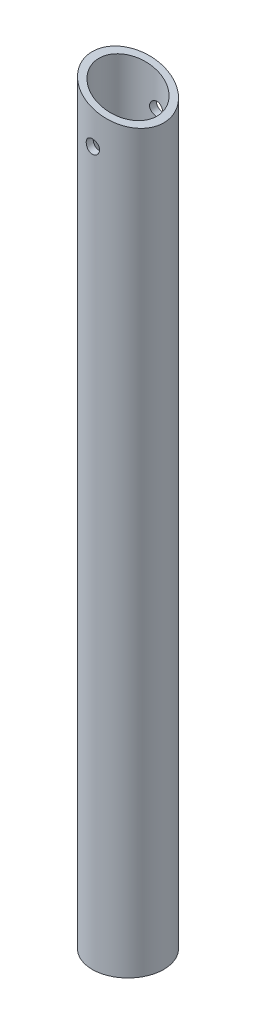
ISO-10303-21;
HEADER;
FILE_DESCRIPTION(('STEP AP214'),'2;1');
FILE_NAME('part.step','',(''),(''),'','','');
FILE_SCHEMA(('AUTOMOTIVE_DESIGN { 1 0 10303 214 1 1 1 1 }'));
ENDSEC;
DATA;
#1=APPLICATION_CONTEXT('core data for automotive mechanical design processes');
#2=APPLICATION_PROTOCOL_DEFINITION('international standard','automotive_design',2000,#1);
#3=PRODUCT_CONTEXT('',#1,'mechanical');
#4=PRODUCT('Part','Part','',(#3));
#5=PRODUCT_RELATED_PRODUCT_CATEGORY('part','',(#4));
#6=PRODUCT_DEFINITION_FORMATION('','',#4);
#7=PRODUCT_DEFINITION_CONTEXT('part definition',#1,'design');
#8=PRODUCT_DEFINITION('design','',#6,#7);
#9=PRODUCT_DEFINITION_SHAPE('','',#8);
#10=(LENGTH_UNIT() NAMED_UNIT(*) SI_UNIT(.MILLI.,.METRE.));
#11=(NAMED_UNIT(*) PLANE_ANGLE_UNIT() SI_UNIT($,.RADIAN.));
#12=(NAMED_UNIT(*) SI_UNIT($,.STERADIAN.) SOLID_ANGLE_UNIT());
#13=UNCERTAINTY_MEASURE_WITH_UNIT(LENGTH_MEASURE(1.E-05),#10,'distance_accuracy_value','');
#14=(GEOMETRIC_REPRESENTATION_CONTEXT(3) GLOBAL_UNCERTAINTY_ASSIGNED_CONTEXT((#13)) GLOBAL_UNIT_ASSIGNED_CONTEXT((#10,
#11,#12)) REPRESENTATION_CONTEXT('',''));
#15=CARTESIAN_POINT('',(0.,0.,0.));
#16=DIRECTION('',(0.,0.,1.));
#17=DIRECTION('',(1.,0.,0.));
#18=AXIS2_PLACEMENT_3D('',#15,#16,#17);
#19=CARTESIAN_POINT('',(0.,0.,0.));
#20=DIRECTION('',(0.,1.,0.));
#21=DIRECTION('',(0.,0.,1.));
#22=AXIS2_PLACEMENT_3D('',#19,#20,#21);
#23=PLANE('',#22);
#24=CARTESIAN_POINT('',(0.,0.,0.));
#25=DIRECTION('',(0.,1.,0.));
#26=DIRECTION('',(0.,0.,1.));
#27=AXIS2_PLACEMENT_3D('',#24,#25,#26);
#28=CIRCLE('',#27,8.);
#29=CARTESIAN_POINT('',(0.,0.,8.));
#30=VERTEX_POINT('',#29);
#31=EDGE_CURVE('E12',#30,#30,#28,.T.);
#32=ORIENTED_EDGE('',*,*,#31,.F.);
#33=EDGE_LOOP('',(#32));
#34=FACE_BOUND('',#33,.T.);
#35=CARTESIAN_POINT('',(0.,0.,0.));
#36=DIRECTION('',(0.,1.,0.));
#37=DIRECTION('',(0.,0.,1.));
#38=AXIS2_PLACEMENT_3D('',#35,#36,#37);
#39=CIRCLE('',#38,6.5);
#40=CARTESIAN_POINT('',(0.,0.,6.5));
#41=VERTEX_POINT('',#40);
#42=EDGE_CURVE('E62',#41,#41,#39,.T.);
#43=ORIENTED_EDGE('',*,*,#42,.T.);
#44=EDGE_LOOP('',(#43));
#45=FACE_BOUND('',#44,.T.);
#46=ADVANCED_FACE('F48',(#34,#45),#23,.F.);
#47=CARTESIAN_POINT('',(0.,170.,0.));
#48=DIRECTION('',(0.,-1.,0.));
#49=DIRECTION('',(0.,0.,-1.));
#50=AXIS2_PLACEMENT_3D('',#47,#48,#49);
#51=CYLINDRICAL_SURFACE('',#50,8.);
#52=CARTESIAN_POINT('',(0.,161.08823812587,-8.00000000000001));
#53=CARTESIAN_POINT('',(-0.0834717464655491,161.088234936282,-7.99999848833852));
#54=CARTESIAN_POINT('',(-0.166984992730171,161.081247049251,-7.99868009921717));
#55=CARTESIAN_POINT('',(-0.331658129841866,161.053498130752,-7.99354785890523));
#56=CARTESIAN_POINT('',(-0.412815974152295,161.032725475231,-7.98973190166897));
#57=CARTESIAN_POINT('',(-0.570372961851855,160.978065424611,-7.98003138765458));
#58=CARTESIAN_POINT('',(-0.64677633068538,160.944189873418,-7.97414869946486));
#59=CARTESIAN_POINT('',(-0.792807973094041,160.864319248948,-7.96095710599786));
#60=CARTESIAN_POINT('',(-0.862436794477373,160.818325156726,-7.95364831618289));
#61=CARTESIAN_POINT('',(-0.993783715930548,160.714938357867,-7.93831336430503));
#62=CARTESIAN_POINT('',(-1.05540895503186,160.6574286812,-7.93028034856354));
#63=CARTESIAN_POINT('',(-1.16819606135372,160.532894816783,-7.91445318458653));
#64=CARTESIAN_POINT('',(-1.21935717689247,160.465869946101,-7.90665905354526));
#65=CARTESIAN_POINT('',(-1.31014998665798,160.323552037507,-7.89212551245004));
#66=CARTESIAN_POINT('',(-1.34968721969608,160.248197755553,-7.88539493886185));
#67=CARTESIAN_POINT('',(-1.41550524332285,160.091769210694,-7.8738471321199));
#68=CARTESIAN_POINT('',(-1.44178717713103,160.010695441759,-7.86902973396962));
#69=CARTESIAN_POINT('',(-1.48005053503505,159.846122894956,-7.8619226957455));
#70=CARTESIAN_POINT('',(-1.49219390192041,159.762663028667,-7.85960445366407));
#71=CARTESIAN_POINT('',(-1.5023380809535,159.594860741062,-7.85767197152764));
#72=CARTESIAN_POINT('',(-1.50034016135381,159.510518399568,-7.8580574889876));
#73=CARTESIAN_POINT('',(-1.4823897960237,159.344518600604,-7.86146292701752));
#74=CARTESIAN_POINT('',(-1.46662149996049,159.26284041157,-7.86444808147336));
#75=CARTESIAN_POINT('',(-1.42186799396211,159.103309706088,-7.87266183284669));
#76=CARTESIAN_POINT('',(-1.39288222239506,159.025457352361,-7.87789052509517));
#77=CARTESIAN_POINT('',(-1.32233647179308,158.87524944687,-7.89003855292589));
#78=CARTESIAN_POINT('',(-1.28070213532462,158.80292965529,-7.89696783823368));
#79=CARTESIAN_POINT('',(-1.18609368930421,158.66623339733,-7.9117297160292));
#80=CARTESIAN_POINT('',(-1.13311842889271,158.601857738156,-7.91956240015523));
#81=CARTESIAN_POINT('',(-1.01633905685303,158.481813170198,-7.93540001272165));
#82=CARTESIAN_POINT('',(-0.95237743686075,158.426297473419,-7.94340571024033));
#83=CARTESIAN_POINT('',(-0.815968037098896,158.326760885195,-7.95857386108321));
#84=CARTESIAN_POINT('',(-0.743520172255828,158.282740109,-7.96573630595246));
#85=CARTESIAN_POINT('',(-0.59203498887472,158.207420372001,-7.9784253967751));
#86=CARTESIAN_POINT('',(-0.512989564446547,158.176137346753,-7.98394999136292));
#87=CARTESIAN_POINT('',(-0.350639115398744,158.127336032778,-7.99272505402722));
#88=CARTESIAN_POINT('',(-0.267334544277828,158.109816281825,-7.99597576367995));
#89=CARTESIAN_POINT('',(-0.100148652903422,158.089252094852,-7.99980360641982));
#90=CARTESIAN_POINT('',(-0.0162940126341757,158.085997734341,-8.00041950912282));
#91=CARTESIAN_POINT('',(0.150761248092132,158.093493605418,-7.9990154359823));
#92=CARTESIAN_POINT('',(0.233961900480325,158.104243148936,-7.9969955896443));
#93=CARTESIAN_POINT('',(0.396681573218159,158.139267161054,-7.99057111500405));
#94=CARTESIAN_POINT('',(0.476224261046016,158.163435408408,-7.98618522374033));
#95=CARTESIAN_POINT('',(0.630128631824595,158.224495832649,-7.97551842212502));
#96=CARTESIAN_POINT('',(0.704489962595063,158.261388873436,-7.96923738311336));
#97=CARTESIAN_POINT('',(0.84681667151317,158.34731625403,-7.95538030357667));
#98=CARTESIAN_POINT('',(0.914703277015073,158.396478864407,-7.94779086174566));
#99=CARTESIAN_POINT('',(1.04133832326448,158.505376263233,-7.93219343489715));
#100=CARTESIAN_POINT('',(1.10008590976078,158.565112038872,-7.92418541084688));
#101=CARTESIAN_POINT('',(1.20757295872041,158.694410444782,-7.90852475697452));
#102=CARTESIAN_POINT('',(1.25616916218573,158.764093033996,-7.9008782586026));
#103=CARTESIAN_POINT('',(1.34096675057784,158.910755750394,-7.88692985578534));
#104=CARTESIAN_POINT('',(1.37716859613918,158.987735606241,-7.8806279013735));
#105=CARTESIAN_POINT('',(1.43594673512817,159.146443993113,-7.87013024209574));
#106=CARTESIAN_POINT('',(1.45858868794783,159.22814750543,-7.86592440436881));
#107=CARTESIAN_POINT('',(1.48980679326234,159.394285348392,-7.86007203802418));
#108=CARTESIAN_POINT('',(1.49838453270704,159.478719369841,-7.8584252206579));
#109=CARTESIAN_POINT('',(1.5011776214835,159.646486457312,-7.85789199803858));
#110=CARTESIAN_POINT('',(1.49561895003496,159.729815706827,-7.85896215974296));
#111=CARTESIAN_POINT('',(1.470791753788,159.894329547916,-7.86364600660001));
#112=CARTESIAN_POINT('',(1.45152331089327,159.975514152298,-7.86725967655748));
#113=CARTESIAN_POINT('',(1.39991887583258,160.133312610666,-7.87660508023181));
#114=CARTESIAN_POINT('',(1.36760735397249,160.209934717216,-7.88233284594969));
#115=CARTESIAN_POINT('',(1.29085868912201,160.356706380111,-7.89526387551842));
#116=CARTESIAN_POINT('',(1.2464206894818,160.426855478715,-7.90246724360119));
#117=CARTESIAN_POINT('',(1.14589487339528,160.559821805913,-7.91767266107744));
#118=CARTESIAN_POINT('',(1.08964259864298,160.622513538438,-7.92568505353046));
#119=CARTESIAN_POINT('',(0.967427926742238,160.737643288335,-7.94152833918739));
#120=CARTESIAN_POINT('',(0.901463301891558,160.790078946851,-7.94935919027329));
#121=CARTESIAN_POINT('',(0.76098494507181,160.883649078498,-7.96403975968049));
#122=CARTESIAN_POINT('',(0.686399590640453,160.924677554361,-7.97088000990564));
#123=CARTESIAN_POINT('',(0.53129011365377,160.993555762476,-7.9827161938069));
#124=CARTESIAN_POINT('',(0.450771651705185,161.021417872917,-7.98771385879038));
#125=CARTESIAN_POINT('',(0.308347202825083,161.057515440289,-7.99428290707633));
#126=CARTESIAN_POINT('',(0.247273810251794,161.069016756183,-7.99641470878209));
#127=CARTESIAN_POINT('',(0.124141247115075,161.084379187987,-7.99927379954013));
#128=CARTESIAN_POINT('',(0.0620821016526262,161.088240498126,-8.00000112429806));
#129=CARTESIAN_POINT('',(0.,161.08823812587,-8.00000000000001));
#130=B_SPLINE_CURVE_WITH_KNOTS('',3,(#52,#53,#54,#55,#56,#57,#58,#59,#60,#61,#62,#63,#64,#65,
#66,#67,#68,#69,#70,#71,#72,#73,#74,#75,#76,#77,#78,#79,#80,#81,#82,#83,#84,#85,#86,#87,#88,#89,
#90,#91,#92,#93,#94,#95,#96,#97,#98,#99,#100,#101,#102,#103,#104,#105,#106,#107,#108,#109,#110,
#111,#112,#113,#114,#115,#116,#117,#118,#119,#120,#121,#122,#123,#124,#125,#126,#127,#128,#129),
.UNSPECIFIED.,.T.,.F.,(4,2,2,2,2,2,2,2,2,2,2,2,2,2,2,2,2,2,2,2,2,2,2,2,2,2,2,2,2,2,2,2,2,2,2,2,
2,2,4),(0.,0.250188200964912,0.500587642535419,0.750761271230876,1.00091465336886,
1.25375118013625,1.50660586283611,1.76146190504355,2.01629596311945,2.26818151445329,
2.52004447587248,2.76859000612758,3.01714609846783,3.26719262629525,3.51726454049852,
3.7712776846407,4.0252933754494,4.27962588321694,4.53393136673742,4.78448174076092,
5.03501980464579,5.28360233907823,5.53220175338025,5.78351778017702,6.03485728413091,
6.28953436987293,6.54420198954941,6.79762627818557,7.05102196946511,7.30039252231745,
7.54976158541504,7.79866496207689,8.04758592655419,8.30023369966379,8.55293951262252,
8.80792048916313,9.06266126931173,9.24874344524409,9.43482089039541),.UNSPECIFIED.);
#131=CARTESIAN_POINT('',(0.,161.08823812587,-8.00000000000001));
#132=VERTEX_POINT('',#131);
#133=EDGE_CURVE('E67',#132,#132,#130,.T.);
#134=ORIENTED_EDGE('',*,*,#133,.T.);
#135=EDGE_LOOP('',(#134));
#136=FACE_BOUND('',#135,.T.);
#137=CARTESIAN_POINT('',(1.49999999999992,159.58823812587,7.85811682275084));
#138=CARTESIAN_POINT('',(1.49999679883237,159.504780917859,7.85811843793492));
#139=CARTESIAN_POINT('',(1.49301126348931,159.421282177652,7.85946079760263));
#140=CARTESIAN_POINT('',(1.46527253251804,159.256639164289,7.86467851014362));
#141=CARTESIAN_POINT('',(1.44450765768474,159.175496949443,7.86855601173206));
#142=CARTESIAN_POINT('',(1.38987035617784,159.0179730545,7.87838976464885));
#143=CARTESIAN_POINT('',(1.35601013954372,158.941587016563,7.88434407905994));
#144=CARTESIAN_POINT('',(1.27617565760363,158.795584566584,7.89765826320956));
#145=CARTESIAN_POINT('',(1.23020233759189,158.725967626867,7.90501802325622));
#146=CARTESIAN_POINT('',(1.12683678942618,158.594607926671,7.92041614838945));
#147=CARTESIAN_POINT('',(1.0693229293309,158.532961642399,7.92846116625676));
#148=CARTESIAN_POINT('',(0.944771778803541,158.420133736271,7.94426457664031));
#149=CARTESIAN_POINT('',(0.877733863624922,158.368952801446,7.95202295031152));
#150=CARTESIAN_POINT('',(0.735403894570143,158.27813874927,7.96645017828404));
#151=CARTESIAN_POINT('',(0.660052840033863,158.238596592351,7.97311028052359));
#152=CARTESIAN_POINT('',(0.503631283250773,158.172768583597,7.98451608632928));
#153=CARTESIAN_POINT('',(0.422561251859514,158.14648164188,7.98926194728335));
#154=CARTESIAN_POINT('',(0.258002746187417,158.108208577259,7.99625755123779));
#155=CARTESIAN_POINT('',(0.174553323244854,158.096059819948,7.99853565976324));
#156=CARTESIAN_POINT('',(0.00677167603537077,158.08590123817,8.00043684615591));
#157=CARTESIAN_POINT('',(-0.0775604724476873,158.087890209731,8.00006015010697));
#158=CARTESIAN_POINT('',(-0.243598357899423,158.105825897018,7.99671633763242));
#159=CARTESIAN_POINT('',(-0.3253237604515,158.121597495301,7.99378172247211));
#160=CARTESIAN_POINT('',(-0.484947165715499,158.166373775266,7.98568826333558));
#161=CARTESIAN_POINT('',(-0.562845028826553,158.195378939216,7.98052933829965));
#162=CARTESIAN_POINT('',(-0.713110065751531,158.265965856929,7.96851260297338));
#163=CARTESIAN_POINT('',(-0.785443571838551,158.307617613783,7.96164537590823));
#164=CARTESIAN_POINT('',(-0.922159977214663,158.402263794948,7.94697147542847));
#165=CARTESIAN_POINT('',(-0.98654206691081,158.455259372758,7.93916470651163));
#166=CARTESIAN_POINT('',(-1.10656561896907,158.572053828854,7.92333513680565));
#167=CARTESIAN_POINT('',(-1.16205790757045,158.636005909773,7.91531085901618));
#168=CARTESIAN_POINT('',(-1.26155171851264,158.772387657149,7.90006508924618));
#169=CARTESIAN_POINT('',(-1.30555307271185,158.844817447635,7.89284360901352));
#170=CARTESIAN_POINT('',(-1.3808585222448,158.996296396573,7.88001893307122));
#171=CARTESIAN_POINT('',(-1.41214093645423,159.075356583061,7.87441850530258));
#172=CARTESIAN_POINT('',(-1.4609365697506,159.237739309994,7.86551242396687));
#173=CARTESIAN_POINT('',(-1.47845134901115,159.321061366335,7.86220651038621));
#174=CARTESIAN_POINT('',(-1.49899672649745,159.488257454726,7.85831520301006));
#175=CARTESIAN_POINT('',(-1.50224164285862,159.572104241436,7.85768955816134));
#176=CARTESIAN_POINT('',(-1.49472968881726,159.739141580958,7.85912191420837));
#177=CARTESIAN_POINT('',(-1.48397351086435,159.822332166019,7.86117978238612));
#178=CARTESIAN_POINT('',(-1.44894868195885,159.984991028925,7.86770980063206));
#179=CARTESIAN_POINT('',(-1.42479238583991,160.064484378495,7.87216186690876));
#180=CARTESIAN_POINT('',(-1.36377224379061,160.218295315601,7.88296134156616));
#181=CARTESIAN_POINT('',(-1.32690746128796,160.292612521186,7.88930888963281));
#182=CARTESIAN_POINT('',(-1.24102353119661,160.434905744914,7.90327577863685));
#183=CARTESIAN_POINT('',(-1.19186899639622,160.502798663737,7.91090895425312));
#184=CARTESIAN_POINT('',(-1.08298344344249,160.629450166085,7.92654811368098));
#185=CARTESIAN_POINT('',(-1.02325147433088,160.688207927426,7.93455413096495));
#186=CARTESIAN_POINT('',(-0.893949417870436,160.795721889405,7.95016624005947));
#187=CARTESIAN_POINT('',(-0.824258534095928,160.844333952476,7.95776555833302));
#188=CARTESIAN_POINT('',(-0.677574523040174,160.929159332048,7.97159404810347));
#189=CARTESIAN_POINT('',(-0.600581677038573,160.965373125895,7.97782327234725));
#190=CARTESIAN_POINT('',(-0.441877541578731,161.024158223735,7.98818057995848));
#191=CARTESIAN_POINT('',(-0.360193213079027,161.046800313432,7.99231954730139));
#192=CARTESIAN_POINT('',(-0.194096227381601,161.07802517416,7.99807642083742));
#193=CARTESIAN_POINT('',(-0.109683858215881,161.086609424533,7.99969459229934));
#194=CARTESIAN_POINT('',(0.0580907602504762,161.089423427389,8.00022227515442));
#195=CARTESIAN_POINT('',(0.141449307066231,161.083870879,7.9991728662503));
#196=CARTESIAN_POINT('',(0.306023369279161,161.059045698102,7.99456866611699));
#197=CARTESIAN_POINT('',(0.387238905213654,161.039773197126,7.9910138989067));
#198=CARTESIAN_POINT('',(0.545106475595446,160.988146918487,7.98179837978043));
#199=CARTESIAN_POINT('',(0.621766319318179,160.955816312989,7.97614135981573));
#200=CARTESIAN_POINT('',(0.768605631316638,160.879017672215,7.96333372068769));
#201=CARTESIAN_POINT('',(0.838784665003208,160.834548823764,7.95618300146483));
#202=CARTESIAN_POINT('',(0.971755027779948,160.733986671428,7.94104779859941));
#203=CARTESIAN_POINT('',(1.03442623539048,160.677736092009,7.9330528459127));
#204=CARTESIAN_POINT('',(1.14951536065482,160.555533563378,7.9171963353883));
#205=CARTESIAN_POINT('',(1.20193086324778,160.489579335497,7.90933480936763));
#206=CARTESIAN_POINT('',(1.29547633945382,160.349111671167,7.89455577425924));
#207=CARTESIAN_POINT('',(1.33649740531868,160.274524686203,7.88764767280726));
#208=CARTESIAN_POINT('',(1.40536132423413,160.119412335891,7.8756708465003));
#209=CARTESIAN_POINT('',(1.43321661638909,160.038892659281,7.87060038649115));
#210=CARTESIAN_POINT('',(1.46929726596173,159.896485837805,7.86393016292123));
#211=CARTESIAN_POINT('',(1.48079105739849,159.835432402109,7.86176310717929));
#212=CARTESIAN_POINT('',(1.49614351076211,159.71233965745,7.85885585595502));
#213=CARTESIAN_POINT('',(1.50000238052119,159.65030037537,7.85811562163281));
#214=CARTESIAN_POINT('',(1.49999999999992,159.58823812587,7.85811682275084));
#215=B_SPLINE_CURVE_WITH_KNOTS('',3,(#137,#138,#139,#140,#141,#142,#143,#144,#145,#146,#147,
#148,#149,#150,#151,#152,#153,#154,#155,#156,#157,#158,#159,#160,#161,#162,#163,#164,#165,#166,
#167,#168,#169,#170,#171,#172,#173,#174,#175,#176,#177,#178,#179,#180,#181,#182,#183,#184,#185,
#186,#187,#188,#189,#190,#191,#192,#193,#194,#195,#196,#197,#198,#199,#200,#201,#202,#203,#204,
#205,#206,#207,#208,#209,#210,#211,#212,#213,#214),.UNSPECIFIED.,.T.,.F.,(4,2,2,2,2,2,2,2,2,2,2,
2,2,2,2,2,2,2,2,2,2,2,2,2,2,2,2,2,2,2,2,2,2,2,2,2,2,2,4),(0.,0.250144505793205,0.50050130238039,
0.750625227978428,1.00072963993907,1.25362335698688,1.5065336706931,1.76137104348042,
2.01618745939636,2.26804275460258,2.51987660200647,2.76855650598723,3.01724547328422,
3.26733691984216,3.51745380911782,3.77140614764064,4.02536220192399,4.27974936118265,
4.53410768866487,4.78463248587077,5.0351448933872,5.2835879231537,5.53204926624317,
5.78337862654144,6.03473059394676,6.28944125495868,6.54414210821703,6.79750269418682,
7.0508366166733,7.30029300570137,7.54974700322165,7.79876026530355,8.04779021357108,
8.30038464008743,8.55303847730761,8.80803001818116,9.0627801574912,9.24880307527214,
9.43482092920425),.UNSPECIFIED.);
#216=CARTESIAN_POINT('',(1.49999999999992,159.58823812587,7.85811682275084));
#217=VERTEX_POINT('',#216);
#218=EDGE_CURVE('E92',#217,#217,#215,.T.);
#219=ORIENTED_EDGE('',*,*,#218,.T.);
#220=EDGE_LOOP('',(#219));
#221=FACE_BOUND('',#220,.T.);
#222=CARTESIAN_POINT('',(0.,167.088238125871,0.));
#223=DIRECTION('',(-0.342020143325661,-0.939692620785911,0.));
#224=DIRECTION('',(0.939692620785911,-0.342020143325661,0.));
#225=AXIS2_PLACEMENT_3D('',#222,#223,#224);
#226=ELLIPSE('',#225,8.51342217980727,8.);
#227=CARTESIAN_POINT('',(7.99999999999997,164.176476251741,0.));
#228=VERTEX_POINT('',#227);
#229=EDGE_CURVE('E73',#228,#228,#226,.T.);
#230=ORIENTED_EDGE('',*,*,#229,.T.);
#231=EDGE_LOOP('',(#230));
#232=FACE_BOUND('',#231,.T.);
#233=ORIENTED_EDGE('',*,*,#31,.T.);
#234=EDGE_LOOP('',(#233));
#235=FACE_BOUND('',#234,.T.);
#236=ADVANCED_FACE('F50',(#136,#221,#232,#235),#51,.T.);
#237=CARTESIAN_POINT('',(0.,170.,0.));
#238=DIRECTION('',(0.,-1.,0.));
#239=DIRECTION('',(0.,0.,-1.));
#240=AXIS2_PLACEMENT_3D('',#237,#238,#239);
#241=CYLINDRICAL_SURFACE('',#240,6.5);
#242=CARTESIAN_POINT('',(0.,161.08823812587,-6.50000000000001));
#243=CARTESIAN_POINT('',(-0.0830761724763878,161.088235460515,-6.49999849532867));
#244=CARTESIAN_POINT('',(-0.166183602986877,161.081313199059,-6.49839124214549));
#245=CARTESIAN_POINT('',(-0.330029933246678,161.053840482985,-6.49213500375532));
#246=CARTESIAN_POINT('',(-0.410767233683417,161.033281037429,-6.48748401185166));
#247=CARTESIAN_POINT('',(-0.56748240064949,160.97921842693,-6.47565710646771));
#248=CARTESIAN_POINT('',(-0.643465410432001,160.945729540739,-6.46848397910975));
#249=CARTESIAN_POINT('',(-0.788732955280558,160.866805860802,-6.45238316831831));
#250=CARTESIAN_POINT('',(-0.858017512836019,160.821371107165,-6.44345549077588));
#251=CARTESIAN_POINT('',(-0.989152353123286,160.718992874193,-6.4246432330502));
#252=CARTESIAN_POINT('',(-1.05086679216126,160.661877764168,-6.4147456865414));
#253=CARTESIAN_POINT('',(-1.16393060397699,160.538128199299,-6.39519859507269));
#254=CARTESIAN_POINT('',(-1.21527896649915,160.47149281771,-6.38554907436474));
#255=CARTESIAN_POINT('',(-1.30676695752565,160.32957119831,-6.36746174180576));
#256=CARTESIAN_POINT('',(-1.34675925477792,160.254187684894,-6.35904049089484));
#257=CARTESIAN_POINT('',(-1.41345395330066,160.09754302722,-6.34455046029966));
#258=CARTESIAN_POINT('',(-1.44015813854155,160.016282673625,-6.33848136485541));
#259=CARTESIAN_POINT('',(-1.47906424258566,159.851672324288,-6.32951534623235));
#260=CARTESIAN_POINT('',(-1.49150809496883,159.768382452496,-6.32656557105075));
#261=CARTESIAN_POINT('',(-1.50229307046535,159.600849038825,-6.32401364937954));
#262=CARTESIAN_POINT('',(-1.50063613156312,159.516605629588,-6.32441104286172));
#263=CARTESIAN_POINT('',(-1.48346063285707,159.351375318047,-6.32846083321138));
#264=CARTESIAN_POINT('',(-1.46822575315182,159.270357044527,-6.33204661249558));
#265=CARTESIAN_POINT('',(-1.42477741479352,159.112058333969,-6.34196351386391));
#266=CARTESIAN_POINT('',(-1.39656315462676,159.034778128093,-6.34829480548987));
#267=CARTESIAN_POINT('',(-1.32770349075051,158.88536545423,-6.36305332227187));
#268=CARTESIAN_POINT('',(-1.28695129246532,158.81328404496,-6.37149843240947));
#269=CARTESIAN_POINT('',(-1.19424748975261,158.676878889581,-6.38952239681956));
#270=CARTESIAN_POINT('',(-1.14229419645537,158.612556315611,-6.39910142196226));
#271=CARTESIAN_POINT('',(-1.02717321086461,158.49186417582,-6.41859777640794));
#272=CARTESIAN_POINT('',(-0.963764950845132,158.435724240746,-6.42851768847715));
#273=CARTESIAN_POINT('',(-0.828318641053458,158.334835054895,-6.44736816069403));
#274=CARTESIAN_POINT('',(-0.756280398745056,158.290086058322,-6.45629869876004));
#275=CARTESIAN_POINT('',(-0.605321277972394,158.213182211727,-6.47219854082993));
#276=CARTESIAN_POINT('',(-0.526383143294296,158.181060110178,-6.4791627320242));
#277=CARTESIAN_POINT('',(-0.364032396252643,158.130601982175,-6.49030757986405));
#278=CARTESIAN_POINT('',(-0.280620512374287,158.112263718482,-6.49448868821629));
#279=CARTESIAN_POINT('',(-0.113657323931682,158.090233975522,-6.49953102945198));
#280=CARTESIAN_POINT('',(-0.0301494450127744,158.086229189811,-6.50046326526888));
#281=CARTESIAN_POINT('',(0.136342371579172,158.09212714063,-6.49910299913132));
#282=CARTESIAN_POINT('',(0.21932634856269,158.102028820939,-6.49681074208307));
#283=CARTESIAN_POINT('',(0.381357903797977,158.135199322476,-6.48930412349637));
#284=CARTESIAN_POINT('',(0.460441464875665,158.158301367188,-6.4841262394187));
#285=CARTESIAN_POINT('',(0.613609622481626,158.217029714795,-6.47142910428791));
#286=CARTESIAN_POINT('',(0.687693760726533,158.252657164006,-6.46390963894222));
#287=CARTESIAN_POINT('',(0.830037615110141,158.336060769792,-6.44718996088193));
#288=CARTESIAN_POINT('',(0.898188410296304,158.384017817756,-6.43796535296187));
#289=CARTESIAN_POINT('',(1.02558718048178,158.490483743229,-6.41890391913984));
#290=CARTESIAN_POINT('',(1.08483385664761,158.548994157412,-6.40906700421674));
#291=CARTESIAN_POINT('',(1.19400102833015,158.67635051175,-6.38964047483403));
#292=CARTESIAN_POINT('',(1.24370343589041,158.745385090548,-6.38006017503742));
#293=CARTESIAN_POINT('',(1.33081235446407,158.891004006086,-6.36246188496287));
#294=CARTESIAN_POINT('',(1.36821941224614,158.967588006909,-6.35444382521927));
#295=CARTESIAN_POINT('',(1.42941066868123,159.125714114293,-6.34095951164846));
#296=CARTESIAN_POINT('',(1.45327404481079,159.207224255554,-6.33547846174881));
#297=CARTESIAN_POINT('',(1.48692530676325,159.373242118718,-6.32766600549563));
#298=CARTESIAN_POINT('',(1.49671574099559,159.45774929506,-6.32533402889437));
#299=CARTESIAN_POINT('',(1.50182536015782,159.625156352923,-6.32412253425543));
#300=CARTESIAN_POINT('',(1.49749127871469,159.708045236519,-6.32516029248238));
#301=CARTESIAN_POINT('',(1.47525685980879,159.871876804539,-6.33038270361017));
#302=CARTESIAN_POINT('',(1.45735672124415,159.952819517478,-6.33456731037361));
#303=CARTESIAN_POINT('',(1.4086742072014,160.110148036662,-6.34556939165104));
#304=CARTESIAN_POINT('',(1.3779477103357,160.186551986576,-6.3523754359282));
#305=CARTESIAN_POINT('',(1.30453082227098,160.333169932412,-6.36785683112451));
#306=CARTESIAN_POINT('',(1.2618390258151,160.403383199998,-6.37653240158129));
#307=CARTESIAN_POINT('',(1.16457679516258,160.537323654461,-6.39501829374308));
#308=CARTESIAN_POINT('',(1.10976162033283,160.60087024542,-6.40484968682423));
#309=CARTESIAN_POINT('',(0.990297714593165,160.717976373509,-6.42440402438131));
#310=CARTESIAN_POINT('',(0.925646696024331,160.771533580801,-6.43412694306169));
#311=CARTESIAN_POINT('',(0.787191932761505,160.867905393819,-6.45253999299533));
#312=CARTESIAN_POINT('',(0.71326686908484,160.91054924416,-6.46121270567528));
#313=CARTESIAN_POINT('',(0.559109641475318,160.982737275279,-6.47637045552879));
#314=CARTESIAN_POINT('',(0.478882547101879,161.012291860973,-6.4828572293641));
#315=CARTESIAN_POINT('',(0.332210374198707,161.052516599426,-6.49182723396726));
#316=CARTESIAN_POINT('',(0.266526367320948,161.065885396897,-6.49487228966803));
#317=CARTESIAN_POINT('',(0.133901630280776,161.083746992485,-6.49895922451114));
#318=CARTESIAN_POINT('',(0.0669609687897728,161.088240274198,-6.50000121279361));
#319=CARTESIAN_POINT('',(0.,161.08823812587,-6.50000000000001));
#320=B_SPLINE_CURVE_WITH_KNOTS('',3,(#242,#243,#244,#245,#246,#247,#248,#249,#250,#251,#252,
#253,#254,#255,#256,#257,#258,#259,#260,#261,#262,#263,#264,#265,#266,#267,#268,#269,#270,#271,
#272,#273,#274,#275,#276,#277,#278,#279,#280,#281,#282,#283,#284,#285,#286,#287,#288,#289,#290,
#291,#292,#293,#294,#295,#296,#297,#298,#299,#300,#301,#302,#303,#304,#305,#306,#307,#308,#309,
#310,#311,#312,#313,#314,#315,#316,#317,#318,#319),.UNSPECIFIED.,.T.,.F.,(4,2,2,2,2,2,2,2,2,2,2,
2,2,2,2,2,2,2,2,2,2,2,2,2,2,2,2,2,2,2,2,2,2,2,2,2,2,2,4),(0.,0.248983311217109,
0.498130939431084,0.747004202472758,0.995876629917212,1.24870930222223,1.50156660317467,
1.75756840109412,2.01353582069618,2.26509316141453,2.51661592915599,2.76300377758323,
3.00940684320479,3.25796969712261,3.50657005489338,3.76117526279505,4.0157861520354,
4.27105309772998,4.52627860236002,4.77589001432912,5.02548246887367,5.27198911757474,
5.51851833225479,5.7688943375105,6.01930682944867,6.27489540554874,6.53047261420161,
6.78453988631539,7.03856114466412,7.28639401438662,7.53422325058911,7.78098389306526,
8.02777352833796,8.28009323709706,8.53247172132998,8.78858609727294,9.0444965157822,
9.24519271684374,9.44587798236132),.UNSPECIFIED.);
#321=CARTESIAN_POINT('',(0.,161.08823812587,-6.50000000000001));
#322=VERTEX_POINT('',#321);
#323=EDGE_CURVE('E53',#322,#322,#320,.T.);
#324=ORIENTED_EDGE('',*,*,#323,.F.);
#325=EDGE_LOOP('',(#324));
#326=FACE_BOUND('',#325,.T.);
#327=CARTESIAN_POINT('',(1.49999999999995,159.58823812587,6.32455532033674));
#328=CARTESIAN_POINT('',(1.49999731225028,159.505195161056,6.32455698645328));
#329=CARTESIAN_POINT('',(1.49308039515325,159.422120885652,6.32620871498671));
#330=CARTESIAN_POINT('',(1.46563082834669,159.258343363786,6.3326232961548));
#331=CARTESIAN_POINT('',(1.44508905111758,159.177641744681,6.33738823434819));
#332=CARTESIAN_POINT('',(1.39107808122439,159.02100220659,6.34946149326292));
#333=CARTESIAN_POINT('',(1.3576239938208,158.94505884145,6.35676684114115));
#334=CARTESIAN_POINT('',(1.2787823819057,158.799858322426,6.37309417235738));
#335=CARTESIAN_POINT('',(1.23339482024639,158.730601189358,6.3821161610391));
#336=CARTESIAN_POINT('',(1.13106531351179,158.599437898674,6.40104967504166));
#337=CARTESIAN_POINT('',(1.0739411222239,158.537675695309,6.41097365327682));
#338=CARTESIAN_POINT('',(0.95015302238489,158.424518981319,6.43048432059799));
#339=CARTESIAN_POINT('',(0.883488319758327,158.373125334547,6.44007098152559));
#340=CARTESIAN_POINT('',(0.741538525798697,158.281587905418,6.45796329743802));
#341=CARTESIAN_POINT('',(0.666161188886926,158.241583687001,6.46625254288518));
#342=CARTESIAN_POINT('',(0.509529827009763,158.17486527579,6.48047486750577));
#343=CARTESIAN_POINT('',(0.428276539131409,158.148149419388,6.48640824159883));
#344=CARTESIAN_POINT('',(0.263698138287197,158.109221961979,6.49516228038752));
#345=CARTESIAN_POINT('',(0.180433557461676,158.096766402118,6.49803523989434));
#346=CARTESIAN_POINT('',(0.012950428612023,158.085949232206,6.50052632032961));
#347=CARTESIAN_POINT('',(-0.0712679971068554,158.087585835192,6.50014485393696));
#348=CARTESIAN_POINT('',(-0.236582621768792,158.104727142209,6.49620964643356));
#349=CARTESIAN_POINT('',(-0.317707745320481,158.119968757487,6.4927160884058));
#350=CARTESIAN_POINT('',(-0.476216582142223,158.163466851198,6.48301834797383));
#351=CARTESIAN_POINT('',(-0.553600114043666,158.191723959841,6.47681403431541));
#352=CARTESIAN_POINT('',(-0.703145641253921,158.260676201,6.46229685303169));
#353=CARTESIAN_POINT('',(-0.775261043983827,158.301468783771,6.45396755520292));
#354=CARTESIAN_POINT('',(-0.911717486022547,158.394260919055,6.4361101576281));
#355=CARTESIAN_POINT('',(-0.976057353339113,158.446262157749,6.42658187760235));
#356=CARTESIAN_POINT('',(-1.09670294212739,158.561419879024,6.40711077081721));
#357=CARTESIAN_POINT('',(-1.15278844211971,158.6248065381,6.39716345312088));
#358=CARTESIAN_POINT('',(-1.25357772612115,158.760189358083,6.37818005958507));
#359=CARTESIAN_POINT('',(-1.29828112665812,158.832185808942,6.36914401445329));
#360=CARTESIAN_POINT('',(-1.37515073667102,158.983128382915,6.35299268291513));
#361=CARTESIAN_POINT('',(-1.40727114955082,159.062098633458,6.34588444121944));
#362=CARTESIAN_POINT('',(-1.4577163282201,159.224519903094,6.33448805998479));
#363=CARTESIAN_POINT('',(-1.47604355932846,159.307970118605,6.33019941650339));
#364=CARTESIAN_POINT('',(-1.498031821938,159.474959045872,6.32503174049959));
#365=CARTESIAN_POINT('',(-1.50201534258491,159.558453024635,6.32407774971014));
#366=CARTESIAN_POINT('',(-1.49607984528298,159.72491216311,6.32548450645526));
#367=CARTESIAN_POINT('',(-1.48616190022041,159.807877363135,6.32784499818498));
#368=CARTESIAN_POINT('',(-1.45298594915783,159.96977367109,6.33554357373051));
#369=CARTESIAN_POINT('',(-1.42990927996823,160.048744044676,6.3408411553603));
#370=CARTESIAN_POINT('',(-1.37126901136114,160.201696908797,6.35377976011191));
#371=CARTESIAN_POINT('',(-1.33570410783979,160.275678877447,6.36142102796637));
#372=CARTESIAN_POINT('',(-1.25239967909708,160.41793966275,6.3783481643039));
#373=CARTESIAN_POINT('',(-1.20446365753873,160.486100290382,6.3876597581736));
#374=CARTESIAN_POINT('',(-1.09803158820715,160.613528488804,6.40681231547819));
#375=CARTESIAN_POINT('',(-1.03953407290064,160.672794821621,6.41665335234628));
#376=CARTESIAN_POINT('',(-0.912172454289691,160.78202394057,6.43600563629776));
#377=CARTESIAN_POINT('',(-0.843116740081726,160.831765647998,6.44550564512699));
#378=CARTESIAN_POINT('',(-0.697443174334203,160.91894352837,6.46288988462927));
#379=CARTESIAN_POINT('',(-0.620825695362732,160.956380307184,6.47077419484896));
#380=CARTESIAN_POINT('',(-0.462705252392998,161.017587863789,6.48399176445978));
#381=CARTESIAN_POINT('',(-0.381239271946535,161.041450326151,6.48934209685306));
#382=CARTESIAN_POINT('',(-0.215316112505588,161.075114644343,6.49696306189836));
#383=CARTESIAN_POINT('',(-0.130859422766019,161.084918789207,6.49923419591489));
#384=CARTESIAN_POINT('',(0.0365573790394091,161.090075578153,6.50042390805379));
#385=CARTESIAN_POINT('',(0.119506994675745,161.085756822872,6.499418718911));
#386=CARTESIAN_POINT('',(0.283464184827924,161.063531940364,6.49433417348679));
#387=CARTESIAN_POINT('',(0.364471802184771,161.045626113156,6.49025488508534));
#388=CARTESIAN_POINT('',(0.521957811169612,160.996900144287,6.47948846592309));
#389=CARTESIAN_POINT('',(0.598452864232054,160.96613141077,6.47281172349152));
#390=CARTESIAN_POINT('',(0.745235906918246,160.892601444414,6.45755951980288));
#391=CARTESIAN_POINT('',(0.815523222039228,160.84983891049,6.44898385257199));
#392=CARTESIAN_POINT('',(0.949482403657639,160.752489369822,6.43064181454253));
#393=CARTESIAN_POINT('',(1.01298558523272,160.697674205136,6.42085432839477));
#394=CARTESIAN_POINT('',(1.13000416077691,160.578229337323,6.40129818016076));
#395=CARTESIAN_POINT('',(1.18351710393226,160.51359723293,6.39152952327389));
#396=CARTESIAN_POINT('',(1.27982908304763,160.375166145225,6.37294956195203));
#397=CARTESIAN_POINT('',(1.32245215470274,160.301242321023,6.36415514239874));
#398=CARTESIAN_POINT('',(1.39460165995161,160.147090284219,6.34873668426053));
#399=CARTESIAN_POINT('',(1.42413861394217,160.066867197129,6.34211090335333));
#400=CARTESIAN_POINT('',(1.46432382845628,159.920239006937,6.33293595806898));
#401=CARTESIAN_POINT('',(1.47767548439026,159.854597265606,6.32981507708546));
#402=CARTESIAN_POINT('',(1.49551438449413,159.722056451308,6.3256241490536));
#403=CARTESIAN_POINT('',(1.50000216589569,159.655157454791,6.32455397771367));
#404=CARTESIAN_POINT('',(1.49999999999995,159.58823812587,6.32455532033674));
#405=B_SPLINE_CURVE_WITH_KNOTS('',3,(#327,#328,#329,#330,#331,#332,#333,#334,#335,#336,#337,
#338,#339,#340,#341,#342,#343,#344,#345,#346,#347,#348,#349,#350,#351,#352,#353,#354,#355,#356,
#357,#358,#359,#360,#361,#362,#363,#364,#365,#366,#367,#368,#369,#370,#371,#372,#373,#374,#375,
#376,#377,#378,#379,#380,#381,#382,#383,#384,#385,#386,#387,#388,#389,#390,#391,#392,#393,#394,
#395,#396,#397,#398,#399,#400,#401,#402,#403,#404),.UNSPECIFIED.,.T.,.F.,(4,2,2,2,2,2,2,2,2,2,2,
2,2,2,2,2,2,2,2,2,2,2,2,2,2,2,2,2,2,2,2,2,2,2,2,2,2,2,4),(0.,0.248883465803475,
0.497933831393373,0.746693728125517,0.995454399233414,1.24841764299138,1.50140195363389,
1.75736456623771,2.01329512606388,2.2647786533097,2.51623029155066,2.76292232697426,
3.00962630849784,3.25829886944374,3.50700886572534,3.76147084783254,4.0159414018362,
4.27132969927226,4.52667233913442,4.77623696750941,5.02578233606487,5.27196914049442,
5.51818166102454,5.76857543923026,6.01900403679119,6.27468245443432,6.53034828108671,
6.7842661187741,7.03814260781418,7.28615450356153,7.53416092305578,7.78118549040826,
8.02823686531898,8.28044436759842,8.53271366056531,8.78883275968395,9.0447455802291,
9.24531794770388,9.44587815829011),.UNSPECIFIED.);
#406=CARTESIAN_POINT('',(1.49999999999995,159.58823812587,6.32455532033674));
#407=VERTEX_POINT('',#406);
#408=EDGE_CURVE('E74',#407,#407,#405,.T.);
#409=ORIENTED_EDGE('',*,*,#408,.F.);
#410=EDGE_LOOP('',(#409));
#411=FACE_BOUND('',#410,.T.);
#412=CARTESIAN_POINT('',(0.,167.088238125871,0.));
#413=DIRECTION('',(-0.342020143325661,-0.939692620785911,0.));
#414=DIRECTION('',(0.939692620785911,-0.342020143325661,0.));
#415=AXIS2_PLACEMENT_3D('',#412,#413,#414);
#416=ELLIPSE('',#415,6.91715552109341,6.5);
#417=CARTESIAN_POINT('',(6.49999999999997,164.72243160314,0.));
#418=VERTEX_POINT('',#417);
#419=EDGE_CURVE('E71',#418,#418,#416,.T.);
#420=ORIENTED_EDGE('',*,*,#419,.F.);
#421=EDGE_LOOP('',(#420));
#422=FACE_BOUND('',#421,.T.);
#423=ORIENTED_EDGE('',*,*,#42,.F.);
#424=EDGE_LOOP('',(#423));
#425=FACE_BOUND('',#424,.T.);
#426=ADVANCED_FACE('F79',(#326,#411,#422,#425),#241,.F.);
#427=CARTESIAN_POINT('',(-8.00000000000004,170.,-10.));
#428=DIRECTION('',(-0.342020143325661,-0.939692620785911,0.));
#429=DIRECTION('',(0.939692620785911,-0.342020143325661,0.));
#430=AXIS2_PLACEMENT_3D('',#427,#428,#429);
#431=PLANE('',#430);
#432=ORIENTED_EDGE('',*,*,#419,.T.);
#433=EDGE_LOOP('',(#432));
#434=FACE_BOUND('',#433,.T.);
#435=ORIENTED_EDGE('',*,*,#229,.F.);
#436=EDGE_LOOP('',(#435));
#437=FACE_BOUND('',#436,.T.);
#438=ADVANCED_FACE('F87',(#434,#437),#431,.F.);
#439=CARTESIAN_POINT('',(0.,159.58823812587,-10.));
#440=DIRECTION('',(0.,0.,1.));
#441=DIRECTION('',(1.,0.,0.));
#442=AXIS2_PLACEMENT_3D('',#439,#440,#441);
#443=CYLINDRICAL_SURFACE('',#442,1.5);
#444=ORIENTED_EDGE('',*,*,#408,.T.);
#445=EDGE_LOOP('',(#444));
#446=FACE_BOUND('',#445,.T.);
#447=ORIENTED_EDGE('',*,*,#218,.F.);
#448=EDGE_LOOP('',(#447));
#449=FACE_BOUND('',#448,.T.);
#450=ADVANCED_FACE('F85',(#446,#449),#443,.F.);
#451=ORIENTED_EDGE('',*,*,#323,.T.);
#452=EDGE_LOOP('',(#451));
#453=FACE_BOUND('',#452,.T.);
#454=ORIENTED_EDGE('',*,*,#133,.F.);
#455=EDGE_LOOP('',(#454));
#456=FACE_BOUND('',#455,.T.);
#457=ADVANCED_FACE('F82',(#453,#456),#443,.F.);
#458=CLOSED_SHELL('',(#46,#236,#426,#438,#450,#457));
#459=MANIFOLD_SOLID_BREP('B2',#458);
#460=ADVANCED_BREP_SHAPE_REPRESENTATION('',(#18,#459),#14);
#461=SHAPE_DEFINITION_REPRESENTATION(#9,#460);
ENDSEC;
END-ISO-10303-21;
